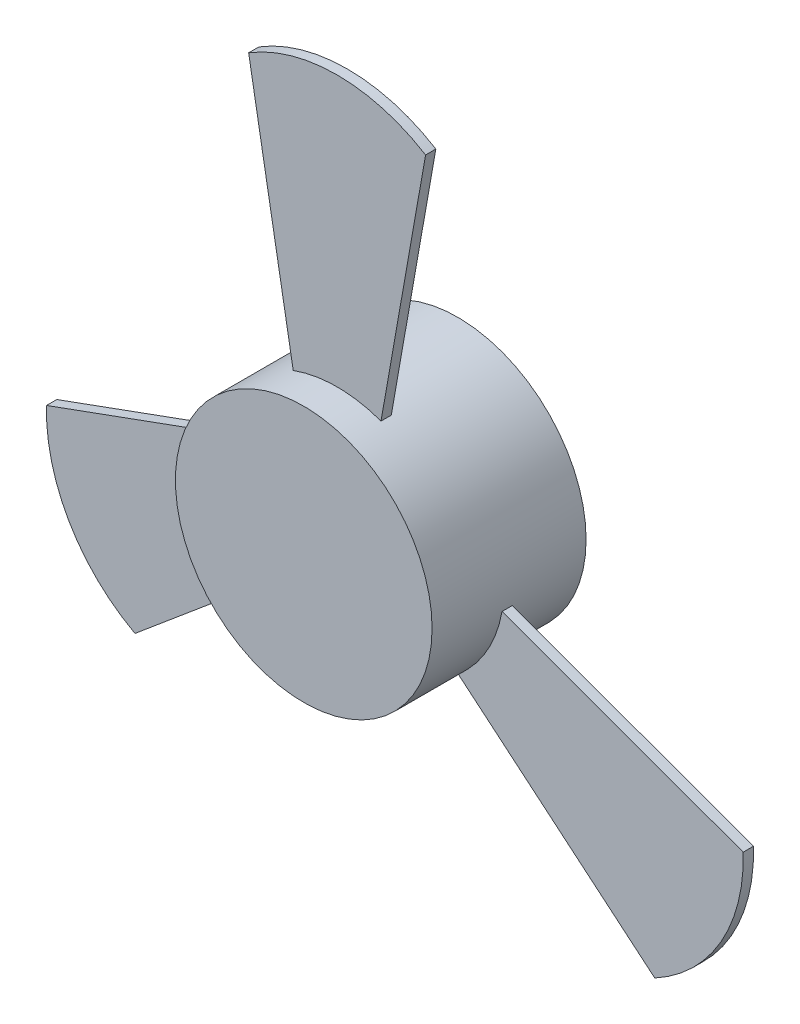
ISO-10303-21;
HEADER;
FILE_DESCRIPTION(('STEP AP214'),'2;1');
FILE_NAME('part.step','',(''),(''),'','','');
FILE_SCHEMA(('AUTOMOTIVE_DESIGN { 1 0 10303 214 1 1 1 1 }'));
ENDSEC;
DATA;
#1=APPLICATION_CONTEXT('core data for automotive mechanical design processes');
#2=APPLICATION_PROTOCOL_DEFINITION('international standard','automotive_design',2000,#1);
#3=PRODUCT_CONTEXT('',#1,'mechanical');
#4=PRODUCT('Part','Part','',(#3));
#5=PRODUCT_RELATED_PRODUCT_CATEGORY('part','',(#4));
#6=PRODUCT_DEFINITION_FORMATION('','',#4);
#7=PRODUCT_DEFINITION_CONTEXT('part definition',#1,'design');
#8=PRODUCT_DEFINITION('design','',#6,#7);
#9=PRODUCT_DEFINITION_SHAPE('','',#8);
#10=(LENGTH_UNIT() NAMED_UNIT(*) SI_UNIT(.MILLI.,.METRE.));
#11=(NAMED_UNIT(*) PLANE_ANGLE_UNIT() SI_UNIT($,.RADIAN.));
#12=(NAMED_UNIT(*) SI_UNIT($,.STERADIAN.) SOLID_ANGLE_UNIT());
#13=UNCERTAINTY_MEASURE_WITH_UNIT(LENGTH_MEASURE(1.E-05),#10,'distance_accuracy_value','');
#14=(GEOMETRIC_REPRESENTATION_CONTEXT(3) GLOBAL_UNCERTAINTY_ASSIGNED_CONTEXT((#13)) GLOBAL_UNIT_ASSIGNED_CONTEXT((#10,
#11,#12)) REPRESENTATION_CONTEXT('',''));
#15=CARTESIAN_POINT('',(0.,0.,0.));
#16=DIRECTION('',(0.,0.,1.));
#17=DIRECTION('',(1.,0.,0.));
#18=AXIS2_PLACEMENT_3D('',#15,#16,#17);
#19=CARTESIAN_POINT('',(0.,0.,60.));
#20=DIRECTION('',(0.,0.,-1.));
#21=DIRECTION('',(-1.,0.,0.));
#22=AXIS2_PLACEMENT_3D('',#19,#20,#21);
#23=CYLINDRICAL_SURFACE('',#22,50.);
#24=CARTESIAN_POINT('',(0.,0.,28.));
#25=DIRECTION('',(0.,0.,1.));
#26=DIRECTION('',(1.,0.,0.));
#27=AXIS2_PLACEMENT_3D('',#24,#25,#26);
#28=CIRCLE('',#27,50.);
#29=CARTESIAN_POINT('',(32.1393804843268,-38.302222155949,28.));
#30=VERTEX_POINT('',#29);
#31=CARTESIAN_POINT('',(49.2403876506104,-8.68240888334675,28.));
#32=VERTEX_POINT('',#31);
#33=EDGE_CURVE('E154',#30,#32,#28,.T.);
#34=ORIENTED_EDGE('',*,*,#33,.F.);
#35=DIRECTION('',(0.,0.,1.));
#36=VECTOR('',#35,1.);
#37=CARTESIAN_POINT('',(32.1393804843268,-38.302222155949,28.));
#38=LINE('',#37,#36);
#39=CARTESIAN_POINT('',(32.1393804843268,-38.302222155949,32.));
#40=VERTEX_POINT('',#39);
#41=EDGE_CURVE('E163',#30,#40,#38,.T.);
#42=ORIENTED_EDGE('',*,*,#41,.T.);
#43=CARTESIAN_POINT('',(0.,0.,32.));
#44=DIRECTION('',(0.,0.,1.));
#45=DIRECTION('',(1.,0.,0.));
#46=AXIS2_PLACEMENT_3D('',#43,#44,#45);
#47=CIRCLE('',#46,50.);
#48=CARTESIAN_POINT('',(49.2403876506104,-8.68240888334674,32.));
#49=VERTEX_POINT('',#48);
#50=EDGE_CURVE('E145',#40,#49,#47,.T.);
#51=ORIENTED_EDGE('',*,*,#50,.T.);
#52=DIRECTION('',(0.,0.,1.));
#53=VECTOR('',#52,1.);
#54=CARTESIAN_POINT('',(49.2403876506104,-8.68240888334675,28.));
#55=LINE('',#54,#53);
#56=EDGE_CURVE('E59',#32,#49,#55,.T.);
#57=ORIENTED_EDGE('',*,*,#56,.F.);
#58=EDGE_LOOP('',(#34,#42,#51,#57));
#59=FACE_BOUND('',#58,.T.);
#60=CARTESIAN_POINT('',(0.,0.,0.));
#61=DIRECTION('',(0.,0.,1.));
#62=DIRECTION('',(1.,0.,0.));
#63=AXIS2_PLACEMENT_3D('',#60,#61,#62);
#64=CIRCLE('',#63,50.);
#65=CARTESIAN_POINT('',(50.,0.,0.));
#66=VERTEX_POINT('',#65);
#67=EDGE_CURVE('E40',#66,#66,#64,.T.);
#68=ORIENTED_EDGE('',*,*,#67,.T.);
#69=EDGE_LOOP('',(#68));
#70=FACE_BOUND('',#69,.T.);
#71=CARTESIAN_POINT('',(0.,0.,60.));
#72=DIRECTION('',(0.,0.,1.));
#73=DIRECTION('',(1.,0.,0.));
#74=AXIS2_PLACEMENT_3D('',#71,#72,#73);
#75=CIRCLE('',#74,50.);
#76=CARTESIAN_POINT('',(50.,0.,60.));
#77=VERTEX_POINT('',#76);
#78=EDGE_CURVE('E11',#77,#77,#75,.T.);
#79=ORIENTED_EDGE('',*,*,#78,.F.);
#80=EDGE_LOOP('',(#79));
#81=FACE_BOUND('',#80,.T.);
#82=CARTESIAN_POINT('',(0.,0.,43.));
#83=DIRECTION('',(0.,0.,1.));
#84=DIRECTION('',(1.,0.,0.));
#85=AXIS2_PLACEMENT_3D('',#82,#83,#84);
#86=CIRCLE('',#85,50.);
#87=CARTESIAN_POINT('',(17.1010071662835,46.9846310392954,43.));
#88=VERTEX_POINT('',#87);
#89=CARTESIAN_POINT('',(-17.1010071662835,46.9846310392954,43.));
#90=VERTEX_POINT('',#89);
#91=EDGE_CURVE('E179',#88,#90,#86,.T.);
#92=ORIENTED_EDGE('',*,*,#91,.F.);
#93=DIRECTION('',(0.,0.,1.));
#94=VECTOR('',#93,1.);
#95=CARTESIAN_POINT('',(17.1010071662835,46.9846310392954,43.));
#96=LINE('',#95,#94);
#97=CARTESIAN_POINT('',(17.1010071662835,46.9846310392954,47.));
#98=VERTEX_POINT('',#97);
#99=EDGE_CURVE('E189',#88,#98,#96,.T.);
#100=ORIENTED_EDGE('',*,*,#99,.T.);
#101=CARTESIAN_POINT('',(0.,0.,47.));
#102=DIRECTION('',(0.,0.,1.));
#103=DIRECTION('',(1.,0.,0.));
#104=AXIS2_PLACEMENT_3D('',#101,#102,#103);
#105=CIRCLE('',#104,50.);
#106=CARTESIAN_POINT('',(-17.1010071662835,46.9846310392954,47.));
#107=VERTEX_POINT('',#106);
#108=EDGE_CURVE('E178',#98,#107,#105,.T.);
#109=ORIENTED_EDGE('',*,*,#108,.T.);
#110=DIRECTION('',(0.,0.,1.));
#111=VECTOR('',#110,1.);
#112=CARTESIAN_POINT('',(-17.1010071662835,46.9846310392954,43.));
#113=LINE('',#112,#111);
#114=EDGE_CURVE('E205',#90,#107,#113,.T.);
#115=ORIENTED_EDGE('',*,*,#114,.F.);
#116=EDGE_LOOP('',(#92,#100,#109,#115));
#117=FACE_BOUND('',#116,.T.);
#118=CARTESIAN_POINT('',(0.,0.,13.));
#119=DIRECTION('',(0.,0.,1.));
#120=DIRECTION('',(1.,0.,0.));
#121=AXIS2_PLACEMENT_3D('',#118,#119,#120);
#122=CIRCLE('',#121,50.);
#123=CARTESIAN_POINT('',(-49.2403876506105,-8.68240888334604,13.));
#124=VERTEX_POINT('',#123);
#125=CARTESIAN_POINT('',(-32.1393804843273,-38.3022221559486,13.));
#126=VERTEX_POINT('',#125);
#127=EDGE_CURVE('E131',#124,#126,#122,.T.);
#128=ORIENTED_EDGE('',*,*,#127,.F.);
#129=DIRECTION('',(0.,0.,1.));
#130=VECTOR('',#129,1.);
#131=CARTESIAN_POINT('',(-49.2403876506105,-8.68240888334604,13.));
#132=LINE('',#131,#130);
#133=CARTESIAN_POINT('',(-49.2403876506105,-8.68240888334604,17.));
#134=VERTEX_POINT('',#133);
#135=EDGE_CURVE('E385',#124,#134,#132,.T.);
#136=ORIENTED_EDGE('',*,*,#135,.T.);
#137=CARTESIAN_POINT('',(0.,0.,17.));
#138=DIRECTION('',(0.,0.,1.));
#139=DIRECTION('',(1.,0.,0.));
#140=AXIS2_PLACEMENT_3D('',#137,#138,#139);
#141=CIRCLE('',#140,50.);
#142=CARTESIAN_POINT('',(-32.1393804843273,-38.3022221559486,17.));
#143=VERTEX_POINT('',#142);
#144=EDGE_CURVE('E144',#134,#143,#141,.T.);
#145=ORIENTED_EDGE('',*,*,#144,.T.);
#146=DIRECTION('',(0.,0.,1.));
#147=VECTOR('',#146,1.);
#148=CARTESIAN_POINT('',(-32.1393804843273,-38.3022221559486,13.));
#149=LINE('',#148,#147);
#150=EDGE_CURVE('E51',#126,#143,#149,.T.);
#151=ORIENTED_EDGE('',*,*,#150,.F.);
#152=EDGE_LOOP('',(#128,#136,#145,#151));
#153=FACE_BOUND('',#152,.T.);
#154=ADVANCED_FACE('F37',(#59,#70,#81,#117,#153),#23,.T.);
#155=CARTESIAN_POINT('',(0.,0.,60.));
#156=DIRECTION('',(0.,0.,1.));
#157=DIRECTION('',(1.,0.,0.));
#158=AXIS2_PLACEMENT_3D('',#155,#156,#157);
#159=PLANE('',#158);
#160=ORIENTED_EDGE('',*,*,#78,.T.);
#161=EDGE_LOOP('',(#160));
#162=FACE_BOUND('',#161,.T.);
#163=ADVANCED_FACE('F217',(#162),#159,.T.);
#164=CARTESIAN_POINT('',(0.,0.,0.));
#165=DIRECTION('',(0.,0.,1.));
#166=DIRECTION('',(1.,0.,0.));
#167=AXIS2_PLACEMENT_3D('',#164,#165,#166);
#168=PLANE('',#167);
#169=ORIENTED_EDGE('',*,*,#67,.F.);
#170=EDGE_LOOP('',(#169));
#171=FACE_BOUND('',#170,.T.);
#172=ADVANCED_FACE('F214',(#171),#168,.F.);
#173=CARTESIAN_POINT('',(-17.1010071662835,46.9846310392954,43.));
#174=DIRECTION('',(0.984807753012208,0.173648177666931,0.));
#175=DIRECTION('',(-0.173648177666931,0.984807753012208,0.));
#176=AXIS2_PLACEMENT_3D('',#173,#174,#175);
#177=PLANE('',#176);
#178=DIRECTION('',(-0.173648177666931,0.984807753012208,0.));
#179=VECTOR('',#178,1.);
#180=CARTESIAN_POINT('',(-17.1010071662835,46.9846310392954,47.));
#181=LINE('',#180,#179);
#182=CARTESIAN_POINT('',(-34.4658249329766,145.465406340516,47.));
#183=VERTEX_POINT('',#182);
#184=EDGE_CURVE('E192',#107,#183,#181,.T.);
#185=ORIENTED_EDGE('',*,*,#184,.T.);
#186=DIRECTION('',(0.,0.,1.));
#187=VECTOR('',#186,1.);
#188=CARTESIAN_POINT('',(-34.4658249329766,145.465406340516,43.));
#189=LINE('',#188,#187);
#190=CARTESIAN_POINT('',(-34.4658249329766,145.465406340516,43.));
#191=VERTEX_POINT('',#190);
#192=EDGE_CURVE('E202',#191,#183,#189,.T.);
#193=ORIENTED_EDGE('',*,*,#192,.F.);
#194=DIRECTION('',(-0.173648177666931,0.984807753012208,0.));
#195=VECTOR('',#194,1.);
#196=CARTESIAN_POINT('',(-17.1010071662835,46.9846310392954,43.));
#197=LINE('',#196,#195);
#198=EDGE_CURVE('E182',#90,#191,#197,.T.);
#199=ORIENTED_EDGE('',*,*,#198,.F.);
#200=ORIENTED_EDGE('',*,*,#114,.T.);
#201=EDGE_LOOP('',(#185,#193,#199,#200));
#202=FACE_BOUND('',#201,.T.);
#203=ADVANCED_FACE('F216',(#202),#177,.F.);
#204=CARTESIAN_POINT('',(0.,89.6508716190357,43.));
#205=DIRECTION('',(0.,0.,1.));
#206=DIRECTION('',(1.,0.,0.));
#207=AXIS2_PLACEMENT_3D('',#204,#205,#206);
#208=CYLINDRICAL_SURFACE('',#207,65.5984403357729);
#209=CARTESIAN_POINT('',(0.,89.6508716190357,47.));
#210=DIRECTION('',(0.,0.,-1.));
#211=DIRECTION('',(1.,0.,0.));
#212=AXIS2_PLACEMENT_3D('',#209,#210,#211);
#213=CIRCLE('',#212,65.5984403357729);
#214=CARTESIAN_POINT('',(34.4658249329766,145.465406340516,47.));
#215=VERTEX_POINT('',#214);
#216=EDGE_CURVE('E194',#183,#215,#213,.T.);
#217=ORIENTED_EDGE('',*,*,#216,.T.);
#218=DIRECTION('',(0.,0.,1.));
#219=VECTOR('',#218,1.);
#220=CARTESIAN_POINT('',(34.4658249329766,145.465406340516,43.));
#221=LINE('',#220,#219);
#222=CARTESIAN_POINT('',(34.4658249329766,145.465406340516,43.));
#223=VERTEX_POINT('',#222);
#224=EDGE_CURVE('E199',#223,#215,#221,.T.);
#225=ORIENTED_EDGE('',*,*,#224,.F.);
#226=CARTESIAN_POINT('',(0.,89.6508716190357,43.));
#227=DIRECTION('',(0.,0.,-1.));
#228=DIRECTION('',(1.,0.,0.));
#229=AXIS2_PLACEMENT_3D('',#226,#227,#228);
#230=CIRCLE('',#229,65.5984403357729);
#231=EDGE_CURVE('E185',#191,#223,#230,.T.);
#232=ORIENTED_EDGE('',*,*,#231,.F.);
#233=ORIENTED_EDGE('',*,*,#192,.T.);
#234=EDGE_LOOP('',(#217,#225,#232,#233));
#235=FACE_BOUND('',#234,.T.);
#236=ADVANCED_FACE('F222',(#235),#208,.T.);
#237=CARTESIAN_POINT('',(17.1010071662835,46.9846310392954,43.));
#238=DIRECTION('',(-0.984807753012208,0.173648177666931,0.));
#239=DIRECTION('',(-0.173648177666931,-0.984807753012208,0.));
#240=AXIS2_PLACEMENT_3D('',#237,#238,#239);
#241=PLANE('',#240);
#242=DIRECTION('',(-0.173648177666931,-0.984807753012208,0.));
#243=VECTOR('',#242,1.);
#244=CARTESIAN_POINT('',(17.1010071662835,46.9846310392954,47.));
#245=LINE('',#244,#243);
#246=EDGE_CURVE('E183',#215,#98,#245,.T.);
#247=ORIENTED_EDGE('',*,*,#246,.T.);
#248=ORIENTED_EDGE('',*,*,#99,.F.);
#249=DIRECTION('',(-0.173648177666931,-0.984807753012208,0.));
#250=VECTOR('',#249,1.);
#251=CARTESIAN_POINT('',(17.1010071662835,46.9846310392954,43.));
#252=LINE('',#251,#250);
#253=EDGE_CURVE('E187',#223,#88,#252,.T.);
#254=ORIENTED_EDGE('',*,*,#253,.F.);
#255=ORIENTED_EDGE('',*,*,#224,.T.);
#256=EDGE_LOOP('',(#247,#248,#254,#255));
#257=FACE_BOUND('',#256,.T.);
#258=ADVANCED_FACE('F262',(#257),#241,.F.);
#259=CARTESIAN_POINT('',(0.,0.,43.));
#260=DIRECTION('',(0.,0.,1.));
#261=DIRECTION('',(1.,0.,0.));
#262=AXIS2_PLACEMENT_3D('',#259,#260,#261);
#263=PLANE('',#262);
#264=ORIENTED_EDGE('',*,*,#91,.T.);
#265=ORIENTED_EDGE('',*,*,#198,.T.);
#266=ORIENTED_EDGE('',*,*,#231,.T.);
#267=ORIENTED_EDGE('',*,*,#253,.T.);
#268=EDGE_LOOP('',(#264,#265,#266,#267));
#269=FACE_BOUND('',#268,.T.);
#270=ADVANCED_FACE('F259',(#269),#263,.F.);
#271=CARTESIAN_POINT('',(0.,0.,47.));
#272=DIRECTION('',(0.,0.,1.));
#273=DIRECTION('',(1.,0.,0.));
#274=AXIS2_PLACEMENT_3D('',#271,#272,#273);
#275=PLANE('',#274);
#276=ORIENTED_EDGE('',*,*,#108,.F.);
#277=ORIENTED_EDGE('',*,*,#246,.F.);
#278=ORIENTED_EDGE('',*,*,#216,.F.);
#279=ORIENTED_EDGE('',*,*,#184,.F.);
#280=EDGE_LOOP('',(#276,#277,#278,#279));
#281=FACE_BOUND('',#280,.T.);
#282=ADVANCED_FACE('F255',(#281),#275,.T.);
#283=CARTESIAN_POINT('',(49.2403876506104,-8.68240888334675,28.));
#284=DIRECTION('',(-0.342020143325672,-0.939692620785907,0.));
#285=DIRECTION('',(0.939692620785907,-0.342020143325672,0.));
#286=AXIS2_PLACEMENT_3D('',#283,#284,#285);
#287=PLANE('',#286);
#288=DIRECTION('',(0.939692620785907,-0.342020143325672,0.));
#289=VECTOR('',#288,1.);
#290=CARTESIAN_POINT('',(49.2403876506104,-8.68240888334675,32.));
#291=LINE('',#290,#289);
#292=CARTESIAN_POINT('',(143.209649729201,-42.884423215914,32.));
#293=VERTEX_POINT('',#292);
#294=EDGE_CURVE('E148',#49,#293,#291,.T.);
#295=ORIENTED_EDGE('',*,*,#294,.T.);
#296=DIRECTION('',(0.,0.,1.));
#297=VECTOR('',#296,1.);
#298=CARTESIAN_POINT('',(143.209649729201,-42.884423215914,28.));
#299=LINE('',#298,#297);
#300=CARTESIAN_POINT('',(143.209649729201,-42.884423215914,28.));
#301=VERTEX_POINT('',#300);
#302=EDGE_CURVE('E174',#301,#293,#299,.T.);
#303=ORIENTED_EDGE('',*,*,#302,.F.);
#304=DIRECTION('',(0.939692620785907,-0.342020143325672,0.));
#305=VECTOR('',#304,1.);
#306=CARTESIAN_POINT('',(49.2403876506104,-8.68240888334675,28.));
#307=LINE('',#306,#305);
#308=EDGE_CURVE('E157',#32,#301,#307,.T.);
#309=ORIENTED_EDGE('',*,*,#308,.F.);
#310=ORIENTED_EDGE('',*,*,#56,.T.);
#311=EDGE_LOOP('',(#295,#303,#309,#310));
#312=FACE_BOUND('',#311,.T.);
#313=ADVANCED_FACE('F245',(#312),#287,.F.);
#314=CARTESIAN_POINT('',(77.639932293502,-44.8254358095182,28.));
#315=DIRECTION('',(0.,0.,1.));
#316=DIRECTION('',(1.,0.,0.));
#317=AXIS2_PLACEMENT_3D('',#314,#315,#316);
#318=CYLINDRICAL_SURFACE('',#317,65.5984403357729);
#319=CARTESIAN_POINT('',(77.639932293502,-44.8254358095182,32.));
#320=DIRECTION('',(0.,0.,-1.));
#321=DIRECTION('',(1.,0.,0.));
#322=AXIS2_PLACEMENT_3D('',#319,#320,#321);
#323=CIRCLE('',#322,65.5984403357729);
#324=CARTESIAN_POINT('',(108.743824796224,-102.580983124604,32.));
#325=VERTEX_POINT('',#324);
#326=EDGE_CURVE('E166',#293,#325,#323,.T.);
#327=ORIENTED_EDGE('',*,*,#326,.T.);
#328=DIRECTION('',(0.,0.,1.));
#329=VECTOR('',#328,1.);
#330=CARTESIAN_POINT('',(108.743824796224,-102.580983124604,28.));
#331=LINE('',#330,#329);
#332=CARTESIAN_POINT('',(108.743824796224,-102.580983124604,28.));
#333=VERTEX_POINT('',#332);
#334=EDGE_CURVE('E171',#333,#325,#331,.T.);
#335=ORIENTED_EDGE('',*,*,#334,.F.);
#336=CARTESIAN_POINT('',(77.639932293502,-44.8254358095182,28.));
#337=DIRECTION('',(0.,0.,-1.));
#338=DIRECTION('',(1.,0.,0.));
#339=AXIS2_PLACEMENT_3D('',#336,#337,#338);
#340=CIRCLE('',#339,65.5984403357729);
#341=EDGE_CURVE('E160',#301,#333,#340,.T.);
#342=ORIENTED_EDGE('',*,*,#341,.F.);
#343=ORIENTED_EDGE('',*,*,#302,.T.);
#344=EDGE_LOOP('',(#327,#335,#342,#343));
#345=FACE_BOUND('',#344,.T.);
#346=ADVANCED_FACE('F247',(#345),#318,.T.);
#347=CARTESIAN_POINT('',(32.1393804843268,-38.302222155949,28.));
#348=DIRECTION('',(0.642787609686544,0.766044443118974,0.));
#349=DIRECTION('',(-0.766044443118974,0.642787609686544,0.));
#350=AXIS2_PLACEMENT_3D('',#347,#348,#349);
#351=PLANE('',#350);
#352=DIRECTION('',(-0.766044443118974,0.642787609686544,0.));
#353=VECTOR('',#352,1.);
#354=CARTESIAN_POINT('',(32.1393804843268,-38.302222155949,32.));
#355=LINE('',#354,#353);
#356=EDGE_CURVE('E158',#325,#40,#355,.T.);
#357=ORIENTED_EDGE('',*,*,#356,.T.);
#358=ORIENTED_EDGE('',*,*,#41,.F.);
#359=DIRECTION('',(-0.766044443118974,0.642787609686544,0.));
#360=VECTOR('',#359,1.);
#361=CARTESIAN_POINT('',(32.1393804843268,-38.302222155949,28.));
#362=LINE('',#361,#360);
#363=EDGE_CURVE('E162',#333,#30,#362,.T.);
#364=ORIENTED_EDGE('',*,*,#363,.F.);
#365=ORIENTED_EDGE('',*,*,#334,.T.);
#366=EDGE_LOOP('',(#357,#358,#364,#365));
#367=FACE_BOUND('',#366,.T.);
#368=ADVANCED_FACE('F239',(#367),#351,.F.);
#369=CARTESIAN_POINT('',(0.,0.,28.));
#370=DIRECTION('',(0.,0.,1.));
#371=DIRECTION('',(1.,0.,0.));
#372=AXIS2_PLACEMENT_3D('',#369,#370,#371);
#373=PLANE('',#372);
#374=ORIENTED_EDGE('',*,*,#33,.T.);
#375=ORIENTED_EDGE('',*,*,#308,.T.);
#376=ORIENTED_EDGE('',*,*,#341,.T.);
#377=ORIENTED_EDGE('',*,*,#363,.T.);
#378=EDGE_LOOP('',(#374,#375,#376,#377));
#379=FACE_BOUND('',#378,.T.);
#380=ADVANCED_FACE('F233',(#379),#373,.F.);
#381=CARTESIAN_POINT('',(0.,0.,32.));
#382=DIRECTION('',(0.,0.,1.));
#383=DIRECTION('',(1.,0.,0.));
#384=AXIS2_PLACEMENT_3D('',#381,#382,#383);
#385=PLANE('',#384);
#386=ORIENTED_EDGE('',*,*,#50,.F.);
#387=ORIENTED_EDGE('',*,*,#356,.F.);
#388=ORIENTED_EDGE('',*,*,#326,.F.);
#389=ORIENTED_EDGE('',*,*,#294,.F.);
#390=EDGE_LOOP('',(#386,#387,#388,#389));
#391=FACE_BOUND('',#390,.T.);
#392=ADVANCED_FACE('F244',(#391),#385,.T.);
#393=CARTESIAN_POINT('',(-32.1393804843273,-38.3022221559486,13.));
#394=DIRECTION('',(-0.642787609686533,0.766044443118984,0.));
#395=DIRECTION('',(-0.766044443118984,-0.642787609686533,0.));
#396=AXIS2_PLACEMENT_3D('',#393,#394,#395);
#397=PLANE('',#396);
#398=DIRECTION('',(-0.766044443118984,-0.642787609686533,0.));
#399=VECTOR('',#398,1.);
#400=CARTESIAN_POINT('',(-32.1393804843273,-38.3022221559486,17.));
#401=LINE('',#400,#399);
#402=CARTESIAN_POINT('',(-108.743824796226,-102.580983124602,17.));
#403=VERTEX_POINT('',#402);
#404=EDGE_CURVE('E383',#143,#403,#401,.T.);
#405=ORIENTED_EDGE('',*,*,#404,.T.);
#406=DIRECTION('',(0.,0.,1.));
#407=VECTOR('',#406,1.);
#408=CARTESIAN_POINT('',(-108.743824796226,-102.580983124602,13.));
#409=LINE('',#408,#407);
#410=CARTESIAN_POINT('',(-108.743824796226,-102.580983124602,13.));
#411=VERTEX_POINT('',#410);
#412=EDGE_CURVE('E127',#411,#403,#409,.T.);
#413=ORIENTED_EDGE('',*,*,#412,.F.);
#414=DIRECTION('',(-0.766044443118984,-0.642787609686533,0.));
#415=VECTOR('',#414,1.);
#416=CARTESIAN_POINT('',(-32.1393804843273,-38.3022221559486,13.));
#417=LINE('',#416,#415);
#418=EDGE_CURVE('E123',#126,#411,#417,.T.);
#419=ORIENTED_EDGE('',*,*,#418,.F.);
#420=ORIENTED_EDGE('',*,*,#150,.T.);
#421=EDGE_LOOP('',(#405,#413,#419,#420));
#422=FACE_BOUND('',#421,.T.);
#423=ADVANCED_FACE('F125',(#422),#397,.F.);
#424=CARTESIAN_POINT('',(-77.6399322935027,-44.8254358095171,13.));
#425=DIRECTION('',(0.,0.,1.));
#426=DIRECTION('',(1.,0.,0.));
#427=AXIS2_PLACEMENT_3D('',#424,#425,#426);
#428=CYLINDRICAL_SURFACE('',#427,65.5984403357729);
#429=CARTESIAN_POINT('',(-77.6399322935027,-44.8254358095171,17.));
#430=DIRECTION('',(0.,0.,-1.));
#431=DIRECTION('',(1.,0.,0.));
#432=AXIS2_PLACEMENT_3D('',#429,#430,#431);
#433=CIRCLE('',#432,65.5984403357729);
#434=CARTESIAN_POINT('',(-143.209649729202,-42.884423215912,17.));
#435=VERTEX_POINT('',#434);
#436=EDGE_CURVE('E391',#403,#435,#433,.T.);
#437=ORIENTED_EDGE('',*,*,#436,.T.);
#438=DIRECTION('',(0.,0.,1.));
#439=VECTOR('',#438,1.);
#440=CARTESIAN_POINT('',(-143.209649729202,-42.884423215912,13.));
#441=LINE('',#440,#439);
#442=CARTESIAN_POINT('',(-143.209649729202,-42.884423215912,13.));
#443=VERTEX_POINT('',#442);
#444=EDGE_CURVE('E150',#443,#435,#441,.T.);
#445=ORIENTED_EDGE('',*,*,#444,.F.);
#446=CARTESIAN_POINT('',(-77.6399322935027,-44.8254358095171,13.));
#447=DIRECTION('',(0.,0.,-1.));
#448=DIRECTION('',(1.,0.,0.));
#449=AXIS2_PLACEMENT_3D('',#446,#447,#448);
#450=CIRCLE('',#449,65.5984403357729);
#451=EDGE_CURVE('E130',#411,#443,#450,.T.);
#452=ORIENTED_EDGE('',*,*,#451,.F.);
#453=ORIENTED_EDGE('',*,*,#412,.T.);
#454=EDGE_LOOP('',(#437,#445,#452,#453));
#455=FACE_BOUND('',#454,.T.);
#456=ADVANCED_FACE('F340',(#455),#428,.T.);
#457=CARTESIAN_POINT('',(-49.2403876506105,-8.68240888334604,13.));
#458=DIRECTION('',(0.342020143325659,-0.939692620785912,0.));
#459=DIRECTION('',(0.939692620785912,0.342020143325659,0.));
#460=AXIS2_PLACEMENT_3D('',#457,#458,#459);
#461=PLANE('',#460);
#462=DIRECTION('',(0.939692620785912,0.342020143325659,0.));
#463=VECTOR('',#462,1.);
#464=CARTESIAN_POINT('',(-49.2403876506105,-8.68240888334604,17.));
#465=LINE('',#464,#463);
#466=EDGE_CURVE('E140',#435,#134,#465,.T.);
#467=ORIENTED_EDGE('',*,*,#466,.T.);
#468=ORIENTED_EDGE('',*,*,#135,.F.);
#469=DIRECTION('',(0.939692620785912,0.342020143325659,0.));
#470=VECTOR('',#469,1.);
#471=CARTESIAN_POINT('',(-49.2403876506105,-8.68240888334604,13.));
#472=LINE('',#471,#470);
#473=EDGE_CURVE('E136',#443,#124,#472,.T.);
#474=ORIENTED_EDGE('',*,*,#473,.F.);
#475=ORIENTED_EDGE('',*,*,#444,.T.);
#476=EDGE_LOOP('',(#467,#468,#474,#475));
#477=FACE_BOUND('',#476,.T.);
#478=ADVANCED_FACE('F349',(#477),#461,.F.);
#479=CARTESIAN_POINT('',(0.,0.,13.));
#480=DIRECTION('',(0.,0.,1.));
#481=DIRECTION('',(1.,0.,0.));
#482=AXIS2_PLACEMENT_3D('',#479,#480,#481);
#483=PLANE('',#482);
#484=ORIENTED_EDGE('',*,*,#127,.T.);
#485=ORIENTED_EDGE('',*,*,#418,.T.);
#486=ORIENTED_EDGE('',*,*,#451,.T.);
#487=ORIENTED_EDGE('',*,*,#473,.T.);
#488=EDGE_LOOP('',(#484,#485,#486,#487));
#489=FACE_BOUND('',#488,.T.);
#490=ADVANCED_FACE('F134',(#489),#483,.F.);
#491=CARTESIAN_POINT('',(0.,0.,17.));
#492=DIRECTION('',(0.,0.,1.));
#493=DIRECTION('',(1.,0.,0.));
#494=AXIS2_PLACEMENT_3D('',#491,#492,#493);
#495=PLANE('',#494);
#496=ORIENTED_EDGE('',*,*,#144,.F.);
#497=ORIENTED_EDGE('',*,*,#466,.F.);
#498=ORIENTED_EDGE('',*,*,#436,.F.);
#499=ORIENTED_EDGE('',*,*,#404,.F.);
#500=EDGE_LOOP('',(#496,#497,#498,#499));
#501=FACE_BOUND('',#500,.T.);
#502=ADVANCED_FACE('F368',(#501),#495,.T.);
#503=CLOSED_SHELL('',(#154,#163,#172,#203,#236,#258,#270,#282,#313,#346,#368,#380,#392,#423,
#456,#478,#490,#502));
#504=MANIFOLD_SOLID_BREP('B2',#503);
#505=ADVANCED_BREP_SHAPE_REPRESENTATION('',(#18,#504),#14);
#506=SHAPE_DEFINITION_REPRESENTATION(#9,#505);
ENDSEC;
END-ISO-10303-21;
